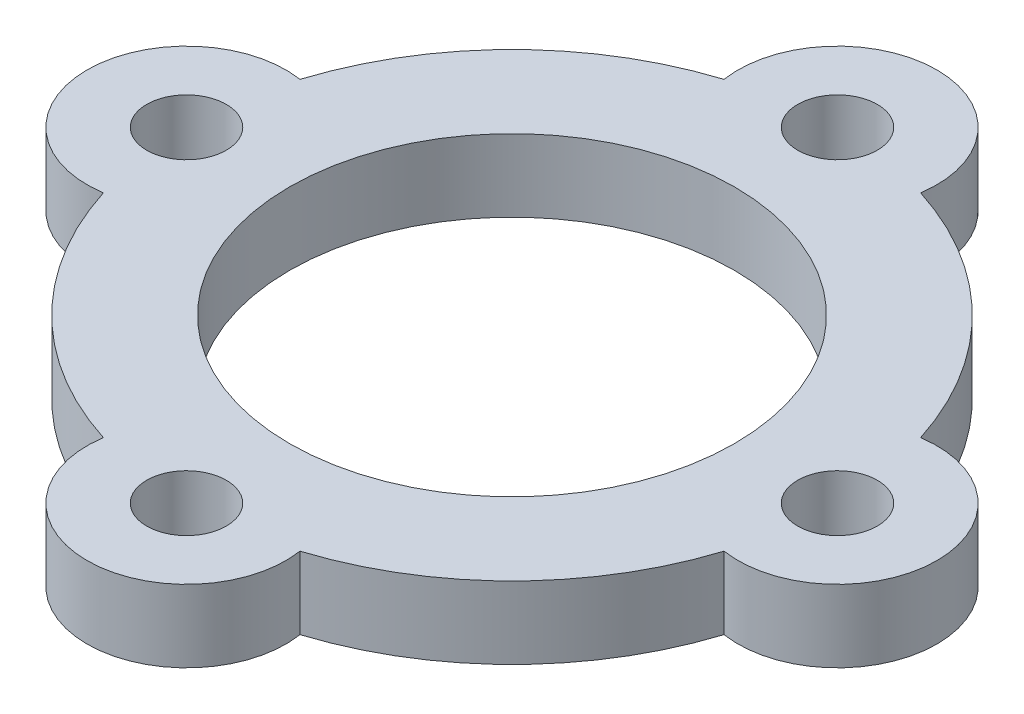
ISO-10303-21;
HEADER;
FILE_DESCRIPTION(('STEP AP214'),'2;1');
FILE_NAME('part.step','',(''),(''),'','','');
FILE_SCHEMA(('AUTOMOTIVE_DESIGN { 1 0 10303 214 1 1 1 1 }'));
ENDSEC;
DATA;
#1=APPLICATION_CONTEXT('core data for automotive mechanical design processes');
#2=APPLICATION_PROTOCOL_DEFINITION('international standard','automotive_design',2000,#1);
#3=PRODUCT_CONTEXT('',#1,'mechanical');
#4=PRODUCT('Part','Part','',(#3));
#5=PRODUCT_RELATED_PRODUCT_CATEGORY('part','',(#4));
#6=PRODUCT_DEFINITION_FORMATION('','',#4);
#7=PRODUCT_DEFINITION_CONTEXT('part definition',#1,'design');
#8=PRODUCT_DEFINITION('design','',#6,#7);
#9=PRODUCT_DEFINITION_SHAPE('','',#8);
#10=(LENGTH_UNIT() NAMED_UNIT(*) SI_UNIT(.MILLI.,.METRE.));
#11=(NAMED_UNIT(*) PLANE_ANGLE_UNIT() SI_UNIT($,.RADIAN.));
#12=(NAMED_UNIT(*) SI_UNIT($,.STERADIAN.) SOLID_ANGLE_UNIT());
#13=UNCERTAINTY_MEASURE_WITH_UNIT(LENGTH_MEASURE(1.E-05),#10,'distance_accuracy_value','');
#14=(GEOMETRIC_REPRESENTATION_CONTEXT(3) GLOBAL_UNCERTAINTY_ASSIGNED_CONTEXT((#13)) GLOBAL_UNIT_ASSIGNED_CONTEXT((#10,
#11,#12)) REPRESENTATION_CONTEXT('',''));
#15=CARTESIAN_POINT('',(0.,0.,0.));
#16=DIRECTION('',(0.,0.,1.));
#17=DIRECTION('',(1.,0.,0.));
#18=AXIS2_PLACEMENT_3D('',#15,#16,#17);
#19=CARTESIAN_POINT('',(9.,2.,0.));
#20=DIRECTION('',(0.,-1.,0.));
#21=DIRECTION('',(0.,0.,-1.));
#22=AXIS2_PLACEMENT_3D('',#19,#20,#21);
#23=CYLINDRICAL_SURFACE('',#22,2.75);
#24=CARTESIAN_POINT('',(9.,0.,0.));
#25=DIRECTION('',(0.,1.,0.));
#26=DIRECTION('',(0.,0.,1.));
#27=AXIS2_PLACEMENT_3D('',#24,#25,#26);
#28=CIRCLE('',#27,2.75);
#29=CARTESIAN_POINT('',(8.57986111111111,0.,2.71771656249198));
#30=VERTEX_POINT('',#29);
#31=CARTESIAN_POINT('',(8.57986111111111,0.,-2.71771656249198));
#32=VERTEX_POINT('',#31);
#33=EDGE_CURVE('E147',#30,#32,#28,.T.);
#34=ORIENTED_EDGE('',*,*,#33,.T.);
#35=DIRECTION('',(0.,-1.,0.));
#36=VECTOR('',#35,1.);
#37=CARTESIAN_POINT('',(8.57986111111111,2.,-2.71771656249198));
#38=LINE('',#37,#36);
#39=CARTESIAN_POINT('',(8.57986111111111,2.,-2.71771656249198));
#40=VERTEX_POINT('',#39);
#41=EDGE_CURVE('E11',#40,#32,#38,.T.);
#42=ORIENTED_EDGE('',*,*,#41,.F.);
#43=CARTESIAN_POINT('',(9.,2.,0.));
#44=DIRECTION('',(0.,1.,0.));
#45=DIRECTION('',(0.,0.,1.));
#46=AXIS2_PLACEMENT_3D('',#43,#44,#45);
#47=CIRCLE('',#46,2.75);
#48=CARTESIAN_POINT('',(8.57986111111111,2.,2.71771656249198));
#49=VERTEX_POINT('',#48);
#50=EDGE_CURVE('E203',#49,#40,#47,.T.);
#51=ORIENTED_EDGE('',*,*,#50,.F.);
#52=DIRECTION('',(0.,-1.,0.));
#53=VECTOR('',#52,1.);
#54=CARTESIAN_POINT('',(8.57986111111111,2.,2.71771656249198));
#55=LINE('',#54,#53);
#56=EDGE_CURVE('E140',#49,#30,#55,.T.);
#57=ORIENTED_EDGE('',*,*,#56,.T.);
#58=EDGE_LOOP('',(#34,#42,#51,#57));
#59=FACE_BOUND('',#58,.T.);
#60=ADVANCED_FACE('F36',(#59),#23,.T.);
#61=CARTESIAN_POINT('',(0.,2.,0.));
#62=DIRECTION('',(0.,-1.,0.));
#63=DIRECTION('',(0.,0.,-1.));
#64=AXIS2_PLACEMENT_3D('',#61,#62,#63);
#65=CYLINDRICAL_SURFACE('',#64,9.);
#66=CARTESIAN_POINT('',(0.,0.,0.));
#67=DIRECTION('',(0.,1.,0.));
#68=DIRECTION('',(0.,0.,1.));
#69=AXIS2_PLACEMENT_3D('',#66,#67,#68);
#70=CIRCLE('',#69,9.);
#71=CARTESIAN_POINT('',(2.71771656249198,0.,-8.57986111111111));
#72=VERTEX_POINT('',#71);
#73=EDGE_CURVE('E150',#32,#72,#70,.T.);
#74=ORIENTED_EDGE('',*,*,#73,.T.);
#75=DIRECTION('',(0.,-1.,0.));
#76=VECTOR('',#75,1.);
#77=CARTESIAN_POINT('',(2.71771656249198,2.,-8.57986111111111));
#78=LINE('',#77,#76);
#79=CARTESIAN_POINT('',(2.71771656249198,2.,-8.57986111111111));
#80=VERTEX_POINT('',#79);
#81=EDGE_CURVE('E45',#80,#72,#78,.T.);
#82=ORIENTED_EDGE('',*,*,#81,.F.);
#83=CARTESIAN_POINT('',(0.,2.,0.));
#84=DIRECTION('',(0.,1.,0.));
#85=DIRECTION('',(0.,0.,1.));
#86=AXIS2_PLACEMENT_3D('',#83,#84,#85);
#87=CIRCLE('',#86,9.);
#88=EDGE_CURVE('E92',#40,#80,#87,.T.);
#89=ORIENTED_EDGE('',*,*,#88,.F.);
#90=ORIENTED_EDGE('',*,*,#41,.T.);
#91=EDGE_LOOP('',(#74,#82,#89,#90));
#92=FACE_BOUND('',#91,.T.);
#93=ADVANCED_FACE('F232',(#92),#65,.T.);
#94=CARTESIAN_POINT('',(0.,2.,-9.));
#95=DIRECTION('',(0.,-1.,0.));
#96=DIRECTION('',(0.,0.,-1.));
#97=AXIS2_PLACEMENT_3D('',#94,#95,#96);
#98=CYLINDRICAL_SURFACE('',#97,2.75);
#99=CARTESIAN_POINT('',(0.,0.,-9.));
#100=DIRECTION('',(0.,1.,0.));
#101=DIRECTION('',(0.,0.,1.));
#102=AXIS2_PLACEMENT_3D('',#99,#100,#101);
#103=CIRCLE('',#102,2.75);
#104=CARTESIAN_POINT('',(-2.71771656249198,0.,-8.57986111111111));
#105=VERTEX_POINT('',#104);
#106=EDGE_CURVE('E152',#72,#105,#103,.T.);
#107=ORIENTED_EDGE('',*,*,#106,.T.);
#108=DIRECTION('',(0.,-1.,0.));
#109=VECTOR('',#108,1.);
#110=CARTESIAN_POINT('',(-2.71771656249198,2.,-8.57986111111111));
#111=LINE('',#110,#109);
#112=CARTESIAN_POINT('',(-2.71771656249198,2.,-8.57986111111111));
#113=VERTEX_POINT('',#112);
#114=EDGE_CURVE('E179',#113,#105,#111,.T.);
#115=ORIENTED_EDGE('',*,*,#114,.F.);
#116=CARTESIAN_POINT('',(0.,2.,-9.));
#117=DIRECTION('',(0.,1.,0.));
#118=DIRECTION('',(0.,0.,1.));
#119=AXIS2_PLACEMENT_3D('',#116,#117,#118);
#120=CIRCLE('',#119,2.75);
#121=EDGE_CURVE('E187',#80,#113,#120,.T.);
#122=ORIENTED_EDGE('',*,*,#121,.F.);
#123=ORIENTED_EDGE('',*,*,#81,.T.);
#124=EDGE_LOOP('',(#107,#115,#122,#123));
#125=FACE_BOUND('',#124,.T.);
#126=ADVANCED_FACE('F185',(#125),#98,.T.);
#127=CARTESIAN_POINT('',(0.,2.,0.));
#128=DIRECTION('',(0.,-1.,0.));
#129=DIRECTION('',(0.,0.,-1.));
#130=AXIS2_PLACEMENT_3D('',#127,#128,#129);
#131=CYLINDRICAL_SURFACE('',#130,9.);
#132=CARTESIAN_POINT('',(0.,0.,0.));
#133=DIRECTION('',(0.,1.,0.));
#134=DIRECTION('',(0.,0.,1.));
#135=AXIS2_PLACEMENT_3D('',#132,#133,#134);
#136=CIRCLE('',#135,9.);
#137=CARTESIAN_POINT('',(-8.57986111111111,0.,-2.71771656249198));
#138=VERTEX_POINT('',#137);
#139=EDGE_CURVE('E154',#105,#138,#136,.T.);
#140=ORIENTED_EDGE('',*,*,#139,.T.);
#141=DIRECTION('',(0.,-1.,0.));
#142=VECTOR('',#141,1.);
#143=CARTESIAN_POINT('',(-8.57986111111111,2.,-2.71771656249198));
#144=LINE('',#143,#142);
#145=CARTESIAN_POINT('',(-8.57986111111111,2.,-2.71771656249198));
#146=VERTEX_POINT('',#145);
#147=EDGE_CURVE('E177',#146,#138,#144,.T.);
#148=ORIENTED_EDGE('',*,*,#147,.F.);
#149=CARTESIAN_POINT('',(0.,2.,0.));
#150=DIRECTION('',(0.,1.,0.));
#151=DIRECTION('',(0.,0.,1.));
#152=AXIS2_PLACEMENT_3D('',#149,#150,#151);
#153=CIRCLE('',#152,9.);
#154=EDGE_CURVE('E198',#113,#146,#153,.T.);
#155=ORIENTED_EDGE('',*,*,#154,.F.);
#156=ORIENTED_EDGE('',*,*,#114,.T.);
#157=EDGE_LOOP('',(#140,#148,#155,#156));
#158=FACE_BOUND('',#157,.T.);
#159=ADVANCED_FACE('F196',(#158),#131,.T.);
#160=CARTESIAN_POINT('',(-9.,2.,0.));
#161=DIRECTION('',(0.,-1.,0.));
#162=DIRECTION('',(0.,0.,-1.));
#163=AXIS2_PLACEMENT_3D('',#160,#161,#162);
#164=CYLINDRICAL_SURFACE('',#163,2.75);
#165=CARTESIAN_POINT('',(-9.,0.,0.));
#166=DIRECTION('',(0.,1.,0.));
#167=DIRECTION('',(0.,0.,1.));
#168=AXIS2_PLACEMENT_3D('',#165,#166,#167);
#169=CIRCLE('',#168,2.75);
#170=CARTESIAN_POINT('',(-8.57986111111111,0.,2.71771656249198));
#171=VERTEX_POINT('',#170);
#172=EDGE_CURVE('E157',#171,#138,#169,.F.);
#173=ORIENTED_EDGE('',*,*,#172,.F.);
#174=DIRECTION('',(0.,-1.,0.));
#175=VECTOR('',#174,1.);
#176=CARTESIAN_POINT('',(-8.57986111111111,2.,2.71771656249198));
#177=LINE('',#176,#175);
#178=CARTESIAN_POINT('',(-8.57986111111111,2.,2.71771656249198));
#179=VERTEX_POINT('',#178);
#180=EDGE_CURVE('E124',#179,#171,#177,.T.);
#181=ORIENTED_EDGE('',*,*,#180,.F.);
#182=CARTESIAN_POINT('',(-9.,2.,0.));
#183=DIRECTION('',(0.,1.,0.));
#184=DIRECTION('',(0.,0.,1.));
#185=AXIS2_PLACEMENT_3D('',#182,#183,#184);
#186=CIRCLE('',#185,2.75);
#187=EDGE_CURVE('E113',#179,#146,#186,.F.);
#188=ORIENTED_EDGE('',*,*,#187,.T.);
#189=ORIENTED_EDGE('',*,*,#147,.T.);
#190=EDGE_LOOP('',(#173,#181,#188,#189));
#191=FACE_BOUND('',#190,.T.);
#192=ADVANCED_FACE('F244',(#191),#164,.T.);
#193=CARTESIAN_POINT('',(0.,2.,0.));
#194=DIRECTION('',(0.,-1.,0.));
#195=DIRECTION('',(0.,0.,-1.));
#196=AXIS2_PLACEMENT_3D('',#193,#194,#195);
#197=CYLINDRICAL_SURFACE('',#196,9.);
#198=CARTESIAN_POINT('',(0.,0.,0.));
#199=DIRECTION('',(0.,1.,0.));
#200=DIRECTION('',(0.,0.,1.));
#201=AXIS2_PLACEMENT_3D('',#198,#199,#200);
#202=CIRCLE('',#201,9.);
#203=CARTESIAN_POINT('',(-2.71771656249198,0.,8.57986111111111));
#204=VERTEX_POINT('',#203);
#205=EDGE_CURVE('E120',#171,#204,#202,.T.);
#206=ORIENTED_EDGE('',*,*,#205,.T.);
#207=DIRECTION('',(0.,-1.,0.));
#208=VECTOR('',#207,1.);
#209=CARTESIAN_POINT('',(-2.71771656249198,2.,8.57986111111111));
#210=LINE('',#209,#208);
#211=CARTESIAN_POINT('',(-2.71771656249198,2.,8.57986111111111));
#212=VERTEX_POINT('',#211);
#213=EDGE_CURVE('E117',#212,#204,#210,.T.);
#214=ORIENTED_EDGE('',*,*,#213,.F.);
#215=CARTESIAN_POINT('',(0.,2.,0.));
#216=DIRECTION('',(0.,1.,0.));
#217=DIRECTION('',(0.,0.,1.));
#218=AXIS2_PLACEMENT_3D('',#215,#216,#217);
#219=CIRCLE('',#218,9.);
#220=EDGE_CURVE('E106',#179,#212,#219,.T.);
#221=ORIENTED_EDGE('',*,*,#220,.F.);
#222=ORIENTED_EDGE('',*,*,#180,.T.);
#223=EDGE_LOOP('',(#206,#214,#221,#222));
#224=FACE_BOUND('',#223,.T.);
#225=ADVANCED_FACE('F118',(#224),#197,.T.);
#226=CARTESIAN_POINT('',(0.,2.,9.));
#227=DIRECTION('',(0.,-1.,0.));
#228=DIRECTION('',(0.,0.,-1.));
#229=AXIS2_PLACEMENT_3D('',#226,#227,#228);
#230=CYLINDRICAL_SURFACE('',#229,2.75);
#231=CARTESIAN_POINT('',(0.,0.,9.));
#232=DIRECTION('',(0.,1.,0.));
#233=DIRECTION('',(0.,0.,1.));
#234=AXIS2_PLACEMENT_3D('',#231,#232,#233);
#235=CIRCLE('',#234,2.75);
#236=CARTESIAN_POINT('',(2.71771656249198,0.,8.57986111111111));
#237=VERTEX_POINT('',#236);
#238=EDGE_CURVE('E161',#237,#204,#235,.F.);
#239=ORIENTED_EDGE('',*,*,#238,.F.);
#240=DIRECTION('',(0.,-1.,0.));
#241=VECTOR('',#240,1.);
#242=CARTESIAN_POINT('',(2.71771656249198,2.,8.57986111111111));
#243=LINE('',#242,#241);
#244=CARTESIAN_POINT('',(2.71771656249198,2.,8.57986111111111));
#245=VERTEX_POINT('',#244);
#246=EDGE_CURVE('E81',#245,#237,#243,.T.);
#247=ORIENTED_EDGE('',*,*,#246,.F.);
#248=CARTESIAN_POINT('',(0.,2.,9.));
#249=DIRECTION('',(0.,1.,0.));
#250=DIRECTION('',(0.,0.,1.));
#251=AXIS2_PLACEMENT_3D('',#248,#249,#250);
#252=CIRCLE('',#251,2.75);
#253=EDGE_CURVE('E111',#245,#212,#252,.F.);
#254=ORIENTED_EDGE('',*,*,#253,.T.);
#255=ORIENTED_EDGE('',*,*,#213,.T.);
#256=EDGE_LOOP('',(#239,#247,#254,#255));
#257=FACE_BOUND('',#256,.T.);
#258=ADVANCED_FACE('F126',(#257),#230,.T.);
#259=CARTESIAN_POINT('',(9.,2.,0.));
#260=DIRECTION('',(0.,-1.,0.));
#261=DIRECTION('',(0.,0.,-1.));
#262=AXIS2_PLACEMENT_3D('',#259,#260,#261);
#263=CYLINDRICAL_SURFACE('',#262,1.1);
#264=CARTESIAN_POINT('',(9.,2.,0.));
#265=DIRECTION('',(0.,1.,0.));
#266=DIRECTION('',(0.,0.,1.));
#267=AXIS2_PLACEMENT_3D('',#264,#265,#266);
#268=CIRCLE('',#267,1.1);
#269=CARTESIAN_POINT('',(9.,2.,1.1));
#270=VERTEX_POINT('',#269);
#271=EDGE_CURVE('E134',#270,#270,#268,.T.);
#272=ORIENTED_EDGE('',*,*,#271,.T.);
#273=EDGE_LOOP('',(#272));
#274=FACE_BOUND('',#273,.T.);
#275=CARTESIAN_POINT('',(9.,0.,0.));
#276=DIRECTION('',(0.,1.,0.));
#277=DIRECTION('',(0.,0.,1.));
#278=AXIS2_PLACEMENT_3D('',#275,#276,#277);
#279=CIRCLE('',#278,1.1);
#280=CARTESIAN_POINT('',(9.,0.,1.1));
#281=VERTEX_POINT('',#280);
#282=EDGE_CURVE('E167',#281,#281,#279,.T.);
#283=ORIENTED_EDGE('',*,*,#282,.F.);
#284=EDGE_LOOP('',(#283));
#285=FACE_BOUND('',#284,.T.);
#286=ADVANCED_FACE('F252',(#274,#285),#263,.F.);
#287=CARTESIAN_POINT('',(0.,2.,9.));
#288=DIRECTION('',(0.,-1.,0.));
#289=DIRECTION('',(0.,0.,-1.));
#290=AXIS2_PLACEMENT_3D('',#287,#288,#289);
#291=CYLINDRICAL_SURFACE('',#290,1.1);
#292=CARTESIAN_POINT('',(0.,2.,9.));
#293=DIRECTION('',(0.,1.,0.));
#294=DIRECTION('',(0.,0.,1.));
#295=AXIS2_PLACEMENT_3D('',#292,#293,#294);
#296=CIRCLE('',#295,1.1);
#297=CARTESIAN_POINT('',(0.,2.,10.1));
#298=VERTEX_POINT('',#297);
#299=EDGE_CURVE('E128',#298,#298,#296,.F.);
#300=ORIENTED_EDGE('',*,*,#299,.F.);
#301=EDGE_LOOP('',(#300));
#302=FACE_BOUND('',#301,.T.);
#303=CARTESIAN_POINT('',(0.,0.,9.));
#304=DIRECTION('',(0.,1.,0.));
#305=DIRECTION('',(0.,0.,1.));
#306=AXIS2_PLACEMENT_3D('',#303,#304,#305);
#307=CIRCLE('',#306,1.1);
#308=CARTESIAN_POINT('',(0.,0.,10.1));
#309=VERTEX_POINT('',#308);
#310=EDGE_CURVE('E164',#309,#309,#307,.F.);
#311=ORIENTED_EDGE('',*,*,#310,.T.);
#312=EDGE_LOOP('',(#311));
#313=FACE_BOUND('',#312,.T.);
#314=ADVANCED_FACE('F255',(#302,#313),#291,.F.);
#315=CARTESIAN_POINT('',(0.,2.,0.));
#316=DIRECTION('',(0.,-1.,0.));
#317=DIRECTION('',(0.,0.,-1.));
#318=AXIS2_PLACEMENT_3D('',#315,#316,#317);
#319=CYLINDRICAL_SURFACE('',#318,9.);
#320=CARTESIAN_POINT('',(0.,0.,0.));
#321=DIRECTION('',(0.,1.,0.));
#322=DIRECTION('',(0.,0.,1.));
#323=AXIS2_PLACEMENT_3D('',#320,#321,#322);
#324=CIRCLE('',#323,9.);
#325=EDGE_CURVE('E84',#237,#30,#324,.T.);
#326=ORIENTED_EDGE('',*,*,#325,.T.);
#327=ORIENTED_EDGE('',*,*,#56,.F.);
#328=CARTESIAN_POINT('',(0.,2.,0.));
#329=DIRECTION('',(0.,1.,0.));
#330=DIRECTION('',(0.,0.,1.));
#331=AXIS2_PLACEMENT_3D('',#328,#329,#330);
#332=CIRCLE('',#331,9.);
#333=EDGE_CURVE('E53',#245,#49,#332,.T.);
#334=ORIENTED_EDGE('',*,*,#333,.F.);
#335=ORIENTED_EDGE('',*,*,#246,.T.);
#336=EDGE_LOOP('',(#326,#327,#334,#335));
#337=FACE_BOUND('',#336,.T.);
#338=ADVANCED_FACE('F222',(#337),#319,.T.);
#339=CARTESIAN_POINT('',(-9.,2.,0.));
#340=DIRECTION('',(0.,-1.,0.));
#341=DIRECTION('',(0.,0.,-1.));
#342=AXIS2_PLACEMENT_3D('',#339,#340,#341);
#343=CYLINDRICAL_SURFACE('',#342,1.1);
#344=CARTESIAN_POINT('',(-9.,2.,0.));
#345=DIRECTION('',(0.,1.,0.));
#346=DIRECTION('',(0.,0.,1.));
#347=AXIS2_PLACEMENT_3D('',#344,#345,#346);
#348=CIRCLE('',#347,1.1);
#349=CARTESIAN_POINT('',(-9.,2.,1.1));
#350=VERTEX_POINT('',#349);
#351=EDGE_CURVE('E205',#350,#350,#348,.F.);
#352=ORIENTED_EDGE('',*,*,#351,.F.);
#353=EDGE_LOOP('',(#352));
#354=FACE_BOUND('',#353,.T.);
#355=CARTESIAN_POINT('',(-9.,0.,0.));
#356=DIRECTION('',(0.,1.,0.));
#357=DIRECTION('',(0.,0.,1.));
#358=AXIS2_PLACEMENT_3D('',#355,#356,#357);
#359=CIRCLE('',#358,1.1);
#360=CARTESIAN_POINT('',(-9.,0.,1.1));
#361=VERTEX_POINT('',#360);
#362=EDGE_CURVE('E144',#361,#361,#359,.F.);
#363=ORIENTED_EDGE('',*,*,#362,.T.);
#364=EDGE_LOOP('',(#363));
#365=FACE_BOUND('',#364,.T.);
#366=ADVANCED_FACE('F219',(#354,#365),#343,.F.);
#367=CARTESIAN_POINT('',(0.,2.,-9.));
#368=DIRECTION('',(0.,-1.,0.));
#369=DIRECTION('',(0.,0.,-1.));
#370=AXIS2_PLACEMENT_3D('',#367,#368,#369);
#371=CYLINDRICAL_SURFACE('',#370,1.1);
#372=CARTESIAN_POINT('',(0.,2.,-9.));
#373=DIRECTION('',(0.,1.,0.));
#374=DIRECTION('',(0.,0.,1.));
#375=AXIS2_PLACEMENT_3D('',#372,#373,#374);
#376=CIRCLE('',#375,1.1);
#377=CARTESIAN_POINT('',(0.,2.,-7.9));
#378=VERTEX_POINT('',#377);
#379=EDGE_CURVE('E173',#378,#378,#376,.T.);
#380=ORIENTED_EDGE('',*,*,#379,.T.);
#381=EDGE_LOOP('',(#380));
#382=FACE_BOUND('',#381,.T.);
#383=CARTESIAN_POINT('',(0.,0.,-9.));
#384=DIRECTION('',(0.,1.,0.));
#385=DIRECTION('',(0.,0.,1.));
#386=AXIS2_PLACEMENT_3D('',#383,#384,#385);
#387=CIRCLE('',#386,1.1);
#388=CARTESIAN_POINT('',(0.,0.,-7.9));
#389=VERTEX_POINT('',#388);
#390=EDGE_CURVE('E141',#389,#389,#387,.T.);
#391=ORIENTED_EDGE('',*,*,#390,.F.);
#392=EDGE_LOOP('',(#391));
#393=FACE_BOUND('',#392,.T.);
#394=ADVANCED_FACE('F38',(#382,#393),#371,.F.);
#395=CARTESIAN_POINT('',(0.,2.,0.));
#396=DIRECTION('',(0.,-1.,0.));
#397=DIRECTION('',(0.,0.,-1.));
#398=AXIS2_PLACEMENT_3D('',#395,#396,#397);
#399=CYLINDRICAL_SURFACE('',#398,6.15);
#400=CARTESIAN_POINT('',(0.,2.,0.));
#401=DIRECTION('',(0.,1.,0.));
#402=DIRECTION('',(0.,0.,1.));
#403=AXIS2_PLACEMENT_3D('',#400,#401,#402);
#404=CIRCLE('',#403,6.15);
#405=CARTESIAN_POINT('',(0.,2.,6.15));
#406=VERTEX_POINT('',#405);
#407=EDGE_CURVE('E137',#406,#406,#404,.T.);
#408=ORIENTED_EDGE('',*,*,#407,.T.);
#409=EDGE_LOOP('',(#408));
#410=FACE_BOUND('',#409,.T.);
#411=CARTESIAN_POINT('',(0.,0.,0.));
#412=DIRECTION('',(0.,1.,0.));
#413=DIRECTION('',(0.,0.,1.));
#414=AXIS2_PLACEMENT_3D('',#411,#412,#413);
#415=CIRCLE('',#414,6.15);
#416=CARTESIAN_POINT('',(0.,0.,6.15));
#417=VERTEX_POINT('',#416);
#418=EDGE_CURVE('E170',#417,#417,#415,.T.);
#419=ORIENTED_EDGE('',*,*,#418,.F.);
#420=EDGE_LOOP('',(#419));
#421=FACE_BOUND('',#420,.T.);
#422=ADVANCED_FACE('F215',(#410,#421),#399,.F.);
#423=CARTESIAN_POINT('',(0.,2.,0.));
#424=DIRECTION('',(0.,1.,0.));
#425=DIRECTION('',(0.,0.,1.));
#426=AXIS2_PLACEMENT_3D('',#423,#424,#425);
#427=PLANE('',#426);
#428=ORIENTED_EDGE('',*,*,#379,.F.);
#429=EDGE_LOOP('',(#428));
#430=FACE_BOUND('',#429,.T.);
#431=ORIENTED_EDGE('',*,*,#351,.T.);
#432=EDGE_LOOP('',(#431));
#433=FACE_BOUND('',#432,.T.);
#434=ORIENTED_EDGE('',*,*,#50,.T.);
#435=ORIENTED_EDGE('',*,*,#88,.T.);
#436=ORIENTED_EDGE('',*,*,#121,.T.);
#437=ORIENTED_EDGE('',*,*,#154,.T.);
#438=ORIENTED_EDGE('',*,*,#187,.F.);
#439=ORIENTED_EDGE('',*,*,#220,.T.);
#440=ORIENTED_EDGE('',*,*,#253,.F.);
#441=ORIENTED_EDGE('',*,*,#333,.T.);
#442=EDGE_LOOP('',(#434,#435,#436,#437,#438,#439,#440,#441));
#443=FACE_BOUND('',#442,.T.);
#444=ORIENTED_EDGE('',*,*,#299,.T.);
#445=EDGE_LOOP('',(#444));
#446=FACE_BOUND('',#445,.T.);
#447=ORIENTED_EDGE('',*,*,#271,.F.);
#448=EDGE_LOOP('',(#447));
#449=FACE_BOUND('',#448,.T.);
#450=ORIENTED_EDGE('',*,*,#407,.F.);
#451=EDGE_LOOP('',(#450));
#452=FACE_BOUND('',#451,.T.);
#453=ADVANCED_FACE('F108',(#430,#433,#443,#446,#449,#452),#427,.T.);
#454=CARTESIAN_POINT('',(0.,0.,0.));
#455=DIRECTION('',(0.,1.,0.));
#456=DIRECTION('',(0.,0.,1.));
#457=AXIS2_PLACEMENT_3D('',#454,#455,#456);
#458=PLANE('',#457);
#459=ORIENTED_EDGE('',*,*,#390,.T.);
#460=EDGE_LOOP('',(#459));
#461=FACE_BOUND('',#460,.T.);
#462=ORIENTED_EDGE('',*,*,#362,.F.);
#463=EDGE_LOOP('',(#462));
#464=FACE_BOUND('',#463,.T.);
#465=ORIENTED_EDGE('',*,*,#33,.F.);
#466=ORIENTED_EDGE('',*,*,#325,.F.);
#467=ORIENTED_EDGE('',*,*,#238,.T.);
#468=ORIENTED_EDGE('',*,*,#205,.F.);
#469=ORIENTED_EDGE('',*,*,#172,.T.);
#470=ORIENTED_EDGE('',*,*,#139,.F.);
#471=ORIENTED_EDGE('',*,*,#106,.F.);
#472=ORIENTED_EDGE('',*,*,#73,.F.);
#473=EDGE_LOOP('',(#465,#466,#467,#468,#469,#470,#471,#472));
#474=FACE_BOUND('',#473,.T.);
#475=ORIENTED_EDGE('',*,*,#310,.F.);
#476=EDGE_LOOP('',(#475));
#477=FACE_BOUND('',#476,.T.);
#478=ORIENTED_EDGE('',*,*,#282,.T.);
#479=EDGE_LOOP('',(#478));
#480=FACE_BOUND('',#479,.T.);
#481=ORIENTED_EDGE('',*,*,#418,.T.);
#482=EDGE_LOOP('',(#481));
#483=FACE_BOUND('',#482,.T.);
#484=ADVANCED_FACE('F191',(#461,#464,#474,#477,#480,#483),#458,.F.);
#485=CLOSED_SHELL('',(#60,#93,#126,#159,#192,#225,#258,#286,#314,#338,#366,#394,#422,#453,#484));
#486=MANIFOLD_SOLID_BREP('B2',#485);
#487=ADVANCED_BREP_SHAPE_REPRESENTATION('',(#18,#486),#14);
#488=SHAPE_DEFINITION_REPRESENTATION(#9,#487);
ENDSEC;
END-ISO-10303-21;
